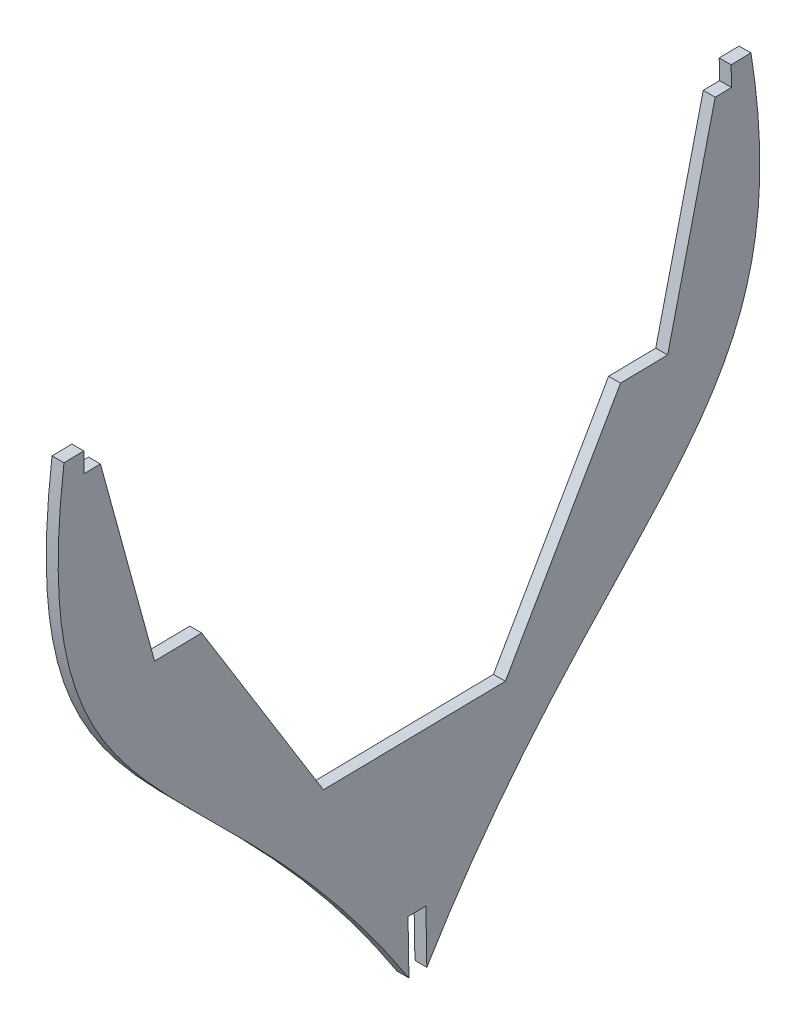
ISO-10303-21;
HEADER;
FILE_DESCRIPTION(('STEP AP214'),'2;1');
FILE_NAME('part.step','',(''),(''),'','','');
FILE_SCHEMA(('AUTOMOTIVE_DESIGN { 1 0 10303 214 1 1 1 1 }'));
ENDSEC;
DATA;
#1=APPLICATION_CONTEXT('core data for automotive mechanical design processes');
#2=APPLICATION_PROTOCOL_DEFINITION('international standard','automotive_design',2000,#1);
#3=PRODUCT_CONTEXT('',#1,'mechanical');
#4=PRODUCT('Part','Part','',(#3));
#5=PRODUCT_RELATED_PRODUCT_CATEGORY('part','',(#4));
#6=PRODUCT_DEFINITION_FORMATION('','',#4);
#7=PRODUCT_DEFINITION_CONTEXT('part definition',#1,'design');
#8=PRODUCT_DEFINITION('design','',#6,#7);
#9=PRODUCT_DEFINITION_SHAPE('','',#8);
#10=(LENGTH_UNIT() NAMED_UNIT(*) SI_UNIT(.MILLI.,.METRE.));
#11=(NAMED_UNIT(*) PLANE_ANGLE_UNIT() SI_UNIT($,.RADIAN.));
#12=(NAMED_UNIT(*) SI_UNIT($,.STERADIAN.) SOLID_ANGLE_UNIT());
#13=UNCERTAINTY_MEASURE_WITH_UNIT(LENGTH_MEASURE(1.E-05),#10,'distance_accuracy_value','');
#14=(GEOMETRIC_REPRESENTATION_CONTEXT(3) GLOBAL_UNCERTAINTY_ASSIGNED_CONTEXT((#13)) GLOBAL_UNIT_ASSIGNED_CONTEXT((#10,
#11,#12)) REPRESENTATION_CONTEXT('',''));
#15=CARTESIAN_POINT('',(0.,0.,0.));
#16=DIRECTION('',(0.,0.,1.));
#17=DIRECTION('',(1.,0.,0.));
#18=AXIS2_PLACEMENT_3D('',#15,#16,#17);
#19=CARTESIAN_POINT('',(6.,346.361590686847,178.714049927488));
#20=CARTESIAN_POINT('',(6.,179.047242687495,199.696494667992));
#21=CARTESIAN_POINT('',(6.,191.032704418316,103.545692170089));
#22=CARTESIAN_POINT('',(6.,27.7480189727311,0.461809733904394));
#23=B_SPLINE_CURVE_WITH_KNOTS('',3,(#19,#20,#21,#22),.UNSPECIFIED.,.F.,.F.,(4,4),(0.,1.),.UNSPECIFIED.);
#24=DIRECTION('',(-1.,0.,0.));
#25=VECTOR('',#24,1.);
#26=SURFACE_OF_LINEAR_EXTRUSION('',#23,#25);
#27=CARTESIAN_POINT('',(0.,346.361590686847,178.714049927488));
#28=CARTESIAN_POINT('',(0.,179.047242687495,199.696494667992));
#29=CARTESIAN_POINT('',(0.,191.032704418316,103.545692170089));
#30=CARTESIAN_POINT('',(0.,27.7480189727311,0.461809733904394));
#31=B_SPLINE_CURVE_WITH_KNOTS('',3,(#27,#28,#29,#30),.UNSPECIFIED.,.F.,.F.,(4,4),(0.,1.),.UNSPECIFIED.);
#32=CARTESIAN_POINT('',(0.,346.361590686847,178.714049927488));
#33=VERTEX_POINT('',#32);
#34=CARTESIAN_POINT('',(0.,34.9595724721525,5.08307792650354));
#35=VERTEX_POINT('',#34);
#36=EDGE_CURVE('E179',#33,#35,#31,.T.);
#37=ORIENTED_EDGE('',*,*,#36,.T.);
#38=DIRECTION('',(1.,0.,0.));
#39=VECTOR('',#38,1.);
#40=CARTESIAN_POINT('',(0.,34.9595724721525,5.08307792650354));
#41=LINE('',#40,#39);
#42=CARTESIAN_POINT('',(6.,34.9595724721525,5.08307792650354));
#43=VERTEX_POINT('',#42);
#44=EDGE_CURVE('E185',#35,#43,#41,.T.);
#45=ORIENTED_EDGE('',*,*,#44,.T.);
#46=CARTESIAN_POINT('',(6.,346.361590686847,178.714049927488));
#47=VERTEX_POINT('',#46);
#48=EDGE_CURVE('E219',#47,#43,#23,.T.);
#49=ORIENTED_EDGE('',*,*,#48,.F.);
#50=DIRECTION('',(-1.,0.,0.));
#51=VECTOR('',#50,1.);
#52=CARTESIAN_POINT('',(6.,346.361590686847,178.714049927488));
#53=LINE('',#52,#51);
#54=EDGE_CURVE('E175',#47,#33,#53,.T.);
#55=ORIENTED_EDGE('',*,*,#54,.T.);
#56=EDGE_LOOP('',(#37,#45,#49,#55));
#57=FACE_BOUND('',#56,.T.);
#58=ADVANCED_FACE('F33',(#57),#26,.F.);
#59=CARTESIAN_POINT('',(6.,27.7480189727311,0.461809733904394));
#60=CARTESIAN_POINT('',(6.,194.372569311942,-97.1313997810856));
#61=CARTESIAN_POINT('',(6.,185.593330999337,-193.627788773328));
#62=CARTESIAN_POINT('',(6.,352.116788837293,-167.089287997528));
#63=B_SPLINE_CURVE_WITH_KNOTS('',3,(#59,#60,#61,#62),.UNSPECIFIED.,.F.,.F.,(4,4),(0.,1.),.UNSPECIFIED.);
#64=DIRECTION('',(-1.,0.,0.));
#65=VECTOR('',#64,1.);
#66=SURFACE_OF_LINEAR_EXTRUSION('',#63,#65);
#67=CARTESIAN_POINT('',(6.,35.1093592951045,-3.91692207349647));
#68=VERTEX_POINT('',#67);
#69=CARTESIAN_POINT('',(6.,352.116788837293,-167.089287997528));
#70=VERTEX_POINT('',#69);
#71=EDGE_CURVE('E116',#68,#70,#63,.T.);
#72=ORIENTED_EDGE('',*,*,#71,.F.);
#73=DIRECTION('',(1.,0.,0.));
#74=VECTOR('',#73,1.);
#75=CARTESIAN_POINT('',(0.,35.1093592951045,-3.91692207349647));
#76=LINE('',#75,#74);
#77=CARTESIAN_POINT('',(0.,35.1093592951045,-3.91692207349647));
#78=VERTEX_POINT('',#77);
#79=EDGE_CURVE('E311',#78,#68,#76,.T.);
#80=ORIENTED_EDGE('',*,*,#79,.F.);
#81=CARTESIAN_POINT('',(0.,27.7480189727311,0.461809733904394));
#82=CARTESIAN_POINT('',(0.,194.372569311942,-97.1313997810856));
#83=CARTESIAN_POINT('',(0.,185.593330999337,-193.627788773328));
#84=CARTESIAN_POINT('',(0.,352.116788837293,-167.089287997528));
#85=B_SPLINE_CURVE_WITH_KNOTS('',3,(#81,#82,#83,#84),.UNSPECIFIED.,.F.,.F.,(4,4),(0.,1.),.UNSPECIFIED.);
#86=CARTESIAN_POINT('',(0.,352.116788837293,-167.089287997528));
#87=VERTEX_POINT('',#86);
#88=EDGE_CURVE('E184',#78,#87,#85,.T.);
#89=ORIENTED_EDGE('',*,*,#88,.T.);
#90=DIRECTION('',(-1.,0.,0.));
#91=VECTOR('',#90,1.);
#92=CARTESIAN_POINT('',(6.,352.116788837293,-167.089287997528));
#93=LINE('',#92,#91);
#94=EDGE_CURVE('E11',#70,#87,#93,.T.);
#95=ORIENTED_EDGE('',*,*,#94,.F.);
#96=EDGE_LOOP('',(#72,#80,#89,#95));
#97=FACE_BOUND('',#96,.T.);
#98=ADVANCED_FACE('F323',(#97),#66,.F.);
#99=CARTESIAN_POINT('',(6.,352.116788837293,-167.089287997528));
#100=DIRECTION('',(0.,-0.999861534367308,-0.0166406758472178));
#101=DIRECTION('',(0.,0.0166406758472178,-0.999861534367308));
#102=AXIS2_PLACEMENT_3D('',#99,#100,#101);
#103=PLANE('',#102);
#104=DIRECTION('',(0.,-0.0166406758472178,0.999861534367308));
#105=VECTOR('',#104,1.);
#106=CARTESIAN_POINT('',(0.,352.116788837293,-167.089287997528));
#107=LINE('',#106,#105);
#108=CARTESIAN_POINT('',(0.,351.950359034013,-157.089287997528));
#109=VERTEX_POINT('',#108);
#110=EDGE_CURVE('E192',#87,#109,#107,.T.);
#111=ORIENTED_EDGE('',*,*,#110,.T.);
#112=DIRECTION('',(-1.,0.,0.));
#113=VECTOR('',#112,1.);
#114=CARTESIAN_POINT('',(6.,351.950359034013,-157.089287997528));
#115=LINE('',#114,#113);
#116=CARTESIAN_POINT('',(6.,351.950359034013,-157.089287997528));
#117=VERTEX_POINT('',#116);
#118=EDGE_CURVE('E41',#117,#109,#115,.T.);
#119=ORIENTED_EDGE('',*,*,#118,.F.);
#120=DIRECTION('',(0.,-0.0166406758472178,0.999861534367308));
#121=VECTOR('',#120,1.);
#122=CARTESIAN_POINT('',(6.,352.116788837293,-167.089287997528));
#123=LINE('',#122,#121);
#124=EDGE_CURVE('E305',#70,#117,#123,.T.);
#125=ORIENTED_EDGE('',*,*,#124,.F.);
#126=ORIENTED_EDGE('',*,*,#94,.T.);
#127=EDGE_LOOP('',(#111,#119,#125,#126));
#128=FACE_BOUND('',#127,.T.);
#129=ADVANCED_FACE('F326',(#128),#103,.F.);
#130=CARTESIAN_POINT('',(6.,351.950359034013,-157.089287997528));
#131=DIRECTION('',(0.,0.0166406758472068,-0.999861534367308));
#132=DIRECTION('',(0.,0.999861534367308,0.0166406758472068));
#133=AXIS2_PLACEMENT_3D('',#130,#131,#132);
#134=PLANE('',#133);
#135=DIRECTION('',(0.,-0.999861534367308,-0.0166406758472068));
#136=VECTOR('',#135,1.);
#137=CARTESIAN_POINT('',(0.,351.950359034013,-157.089287997528));
#138=LINE('',#137,#136);
#139=CARTESIAN_POINT('',(0.,341.950359034013,-157.255717800808));
#140=VERTEX_POINT('',#139);
#141=EDGE_CURVE('E197',#109,#140,#138,.T.);
#142=ORIENTED_EDGE('',*,*,#141,.T.);
#143=DIRECTION('',(-1.,0.,0.));
#144=VECTOR('',#143,1.);
#145=CARTESIAN_POINT('',(6.,341.950359034013,-157.255717800808));
#146=LINE('',#145,#144);
#147=CARTESIAN_POINT('',(6.,341.950359034013,-157.255717800808));
#148=VERTEX_POINT('',#147);
#149=EDGE_CURVE('E244',#148,#140,#146,.T.);
#150=ORIENTED_EDGE('',*,*,#149,.F.);
#151=DIRECTION('',(0.,-0.999861534367308,-0.0166406758472068));
#152=VECTOR('',#151,1.);
#153=CARTESIAN_POINT('',(6.,351.950359034013,-157.089287997528));
#154=LINE('',#153,#152);
#155=EDGE_CURVE('E253',#117,#148,#154,.T.);
#156=ORIENTED_EDGE('',*,*,#155,.F.);
#157=ORIENTED_EDGE('',*,*,#118,.T.);
#158=EDGE_LOOP('',(#142,#150,#156,#157));
#159=FACE_BOUND('',#158,.T.);
#160=ADVANCED_FACE('F251',(#159),#134,.F.);
#161=CARTESIAN_POINT('',(6.,341.950359034013,-157.255717800808));
#162=DIRECTION('',(0.,-0.999861534367309,-0.0166406758471954));
#163=DIRECTION('',(0.,0.0166406758471954,-0.999861534367309));
#164=AXIS2_PLACEMENT_3D('',#161,#162,#163);
#165=PLANE('',#164);
#166=DIRECTION('',(0.,-0.0166406758471954,0.999861534367308));
#167=VECTOR('',#166,1.);
#168=CARTESIAN_POINT('',(0.,341.950359034013,-157.255717800808));
#169=LINE('',#168,#167);
#170=CARTESIAN_POINT('',(0.,341.813982846783,-149.061501107484));
#171=VERTEX_POINT('',#170);
#172=EDGE_CURVE('E199',#140,#171,#169,.T.);
#173=ORIENTED_EDGE('',*,*,#172,.T.);
#174=DIRECTION('',(-1.,0.,0.));
#175=VECTOR('',#174,1.);
#176=CARTESIAN_POINT('',(6.,341.813982846783,-149.061501107484));
#177=LINE('',#176,#175);
#178=CARTESIAN_POINT('',(6.,341.813982846783,-149.061501107484));
#179=VERTEX_POINT('',#178);
#180=EDGE_CURVE('E241',#179,#171,#177,.T.);
#181=ORIENTED_EDGE('',*,*,#180,.F.);
#182=DIRECTION('',(0.,-0.0166406758471954,0.999861534367308));
#183=VECTOR('',#182,1.);
#184=CARTESIAN_POINT('',(6.,341.950359034013,-157.255717800808));
#185=LINE('',#184,#183);
#186=EDGE_CURVE('E275',#148,#179,#185,.T.);
#187=ORIENTED_EDGE('',*,*,#186,.F.);
#188=ORIENTED_EDGE('',*,*,#149,.T.);
#189=EDGE_LOOP('',(#173,#181,#187,#188));
#190=FACE_BOUND('',#189,.T.);
#191=ADVANCED_FACE('F266',(#190),#165,.F.);
#192=CARTESIAN_POINT('',(6.,341.813982846783,-149.061501107484));
#193=DIRECTION('',(0.,-0.231720829517087,-0.972782327742395));
#194=DIRECTION('',(0.,0.972782327742396,-0.231720829517087));
#195=AXIS2_PLACEMENT_3D('',#192,#193,#194);
#196=PLANE('',#195);
#197=DIRECTION('',(0.,-0.972782327742396,0.231720829517087));
#198=VECTOR('',#197,1.);
#199=CARTESIAN_POINT('',(0.,341.813982846783,-149.061501107484));
#200=LINE('',#199,#198);
#201=CARTESIAN_POINT('',(0.,241.402058551779,-125.142959695404));
#202=VERTEX_POINT('',#201);
#203=EDGE_CURVE('E201',#171,#202,#200,.T.);
#204=ORIENTED_EDGE('',*,*,#203,.T.);
#205=DIRECTION('',(-1.,0.,0.));
#206=VECTOR('',#205,1.);
#207=CARTESIAN_POINT('',(6.,241.402058551779,-125.142959695404));
#208=LINE('',#207,#206);
#209=CARTESIAN_POINT('',(6.,241.402058551779,-125.142959695404));
#210=VERTEX_POINT('',#209);
#211=EDGE_CURVE('E238',#210,#202,#208,.T.);
#212=ORIENTED_EDGE('',*,*,#211,.F.);
#213=DIRECTION('',(0.,-0.972782327742396,0.231720829517087));
#214=VECTOR('',#213,1.);
#215=CARTESIAN_POINT('',(6.,341.813982846783,-149.061501107484));
#216=LINE('',#215,#214);
#217=EDGE_CURVE('E272',#179,#210,#216,.T.);
#218=ORIENTED_EDGE('',*,*,#217,.F.);
#219=ORIENTED_EDGE('',*,*,#180,.T.);
#220=EDGE_LOOP('',(#204,#212,#218,#219));
#221=FACE_BOUND('',#220,.T.);
#222=ADVANCED_FACE('F270',(#221),#196,.F.);
#223=CARTESIAN_POINT('',(6.,241.402058551779,-125.142959695404));
#224=DIRECTION('',(0.,-0.999861534367308,-0.0166406758472104));
#225=DIRECTION('',(0.,0.0166406758472104,-0.999861534367308));
#226=AXIS2_PLACEMENT_3D('',#223,#224,#225);
#227=PLANE('',#226);
#228=DIRECTION('',(0.,-0.0166406758472104,0.999861534367308));
#229=VECTOR('',#228,1.);
#230=CARTESIAN_POINT('',(0.,241.402058551779,-125.142959695404));
#231=LINE('',#230,#229);
#232=CARTESIAN_POINT('',(0.,241.007192196553,-101.417259884217));
#233=VERTEX_POINT('',#232);
#234=EDGE_CURVE('E203',#202,#233,#231,.T.);
#235=ORIENTED_EDGE('',*,*,#234,.T.);
#236=DIRECTION('',(-1.,0.,0.));
#237=VECTOR('',#236,1.);
#238=CARTESIAN_POINT('',(6.,241.007192196553,-101.417259884217));
#239=LINE('',#238,#237);
#240=CARTESIAN_POINT('',(6.,241.007192196553,-101.417259884217));
#241=VERTEX_POINT('',#240);
#242=EDGE_CURVE('E235',#241,#233,#239,.T.);
#243=ORIENTED_EDGE('',*,*,#242,.F.);
#244=DIRECTION('',(0.,-0.0166406758472104,0.999861534367308));
#245=VECTOR('',#244,1.);
#246=CARTESIAN_POINT('',(6.,241.402058551779,-125.142959695404));
#247=LINE('',#246,#245);
#248=EDGE_CURVE('E274',#210,#241,#247,.T.);
#249=ORIENTED_EDGE('',*,*,#248,.F.);
#250=ORIENTED_EDGE('',*,*,#211,.T.);
#251=EDGE_LOOP('',(#235,#243,#249,#250));
#252=FACE_BOUND('',#251,.T.);
#253=ADVANCED_FACE('F336',(#252),#227,.F.);
#254=CARTESIAN_POINT('',(6.,241.007192196553,-101.417259884217));
#255=DIRECTION('',(0.,-0.497713186186089,-0.867341676789771));
#256=DIRECTION('',(0.,0.867341676789771,-0.497713186186089));
#257=AXIS2_PLACEMENT_3D('',#254,#255,#256);
#258=PLANE('',#257);
#259=DIRECTION('',(0.,-0.867341676789771,0.497713186186089));
#260=VECTOR('',#259,1.);
#261=CARTESIAN_POINT('',(0.,241.007192196553,-101.417259884217));
#262=LINE('',#261,#260);
#263=CARTESIAN_POINT('',(0.,140.028964648975,-43.472165450215));
#264=VERTEX_POINT('',#263);
#265=EDGE_CURVE('E205',#233,#264,#262,.T.);
#266=ORIENTED_EDGE('',*,*,#265,.T.);
#267=DIRECTION('',(-1.,0.,0.));
#268=VECTOR('',#267,1.);
#269=CARTESIAN_POINT('',(6.,140.028964648975,-43.472165450215));
#270=LINE('',#269,#268);
#271=CARTESIAN_POINT('',(6.,140.028964648975,-43.472165450215));
#272=VERTEX_POINT('',#271);
#273=EDGE_CURVE('E232',#272,#264,#270,.T.);
#274=ORIENTED_EDGE('',*,*,#273,.F.);
#275=DIRECTION('',(0.,-0.867341676789771,0.497713186186089));
#276=VECTOR('',#275,1.);
#277=CARTESIAN_POINT('',(6.,241.007192196553,-101.417259884217));
#278=LINE('',#277,#276);
#279=EDGE_CURVE('E277',#241,#272,#278,.T.);
#280=ORIENTED_EDGE('',*,*,#279,.F.);
#281=ORIENTED_EDGE('',*,*,#242,.T.);
#282=EDGE_LOOP('',(#266,#274,#280,#281));
#283=FACE_BOUND('',#282,.T.);
#284=ADVANCED_FACE('F339',(#283),#258,.F.);
#285=CARTESIAN_POINT('',(6.,138.504801128242,48.1077974347316));
#286=DIRECTION('',(0.,-0.999861534367308,-0.0166406758472082));
#287=DIRECTION('',(0.,0.0166406758472082,-0.999861534367308));
#288=AXIS2_PLACEMENT_3D('',#285,#286,#287);
#289=PLANE('',#288);
#290=DIRECTION('',(0.,-0.0166406758472082,0.999861534367308));
#291=VECTOR('',#290,1.);
#292=CARTESIAN_POINT('',(0.,138.504801128242,48.1077974347316));
#293=LINE('',#292,#291);
#294=CARTESIAN_POINT('',(0.,138.504801128242,48.1077974347316));
#295=VERTEX_POINT('',#294);
#296=EDGE_CURVE('E207',#264,#295,#293,.T.);
#297=ORIENTED_EDGE('',*,*,#296,.T.);
#298=DIRECTION('',(-1.,0.,0.));
#299=VECTOR('',#298,1.);
#300=CARTESIAN_POINT('',(6.,138.504801128242,48.1077974347316));
#301=LINE('',#300,#299);
#302=CARTESIAN_POINT('',(6.,138.504801128242,48.1077974347316));
#303=VERTEX_POINT('',#302);
#304=EDGE_CURVE('E229',#303,#295,#301,.T.);
#305=ORIENTED_EDGE('',*,*,#304,.F.);
#306=DIRECTION('',(0.,-0.0166406758472082,0.999861534367308));
#307=VECTOR('',#306,1.);
#308=CARTESIAN_POINT('',(6.,138.504801128242,48.1077974347316));
#309=LINE('',#308,#307);
#310=EDGE_CURVE('E283',#272,#303,#309,.T.);
#311=ORIENTED_EDGE('',*,*,#310,.F.);
#312=ORIENTED_EDGE('',*,*,#273,.T.);
#313=EDGE_LOOP('',(#297,#305,#311,#312));
#314=FACE_BOUND('',#313,.T.);
#315=ADVANCED_FACE('F343',(#314),#289,.F.);
#316=CARTESIAN_POINT('',(6.,237.498880454126,109.381027038175));
#317=DIRECTION('',(0.,-0.526299846979739,0.850299048023167));
#318=DIRECTION('',(0.,-0.850299048023167,-0.526299846979739));
#319=AXIS2_PLACEMENT_3D('',#316,#317,#318);
#320=PLANE('',#319);
#321=DIRECTION('',(0.,0.850299048023167,0.526299846979739));
#322=VECTOR('',#321,1.);
#323=CARTESIAN_POINT('',(0.,237.498880454126,109.381027038175));
#324=LINE('',#323,#322);
#325=CARTESIAN_POINT('',(0.,237.498880454126,109.381027038175));
#326=VERTEX_POINT('',#325);
#327=EDGE_CURVE('E209',#295,#326,#324,.T.);
#328=ORIENTED_EDGE('',*,*,#327,.T.);
#329=DIRECTION('',(-1.,0.,0.));
#330=VECTOR('',#329,1.);
#331=CARTESIAN_POINT('',(6.,237.498880454126,109.381027038175));
#332=LINE('',#331,#330);
#333=CARTESIAN_POINT('',(6.,237.498880454126,109.381027038175));
#334=VERTEX_POINT('',#333);
#335=EDGE_CURVE('E226',#334,#326,#332,.T.);
#336=ORIENTED_EDGE('',*,*,#335,.F.);
#337=DIRECTION('',(0.,0.850299048023167,0.526299846979739));
#338=VECTOR('',#337,1.);
#339=CARTESIAN_POINT('',(6.,237.498880454126,109.381027038175));
#340=LINE('',#339,#338);
#341=EDGE_CURVE('E285',#303,#334,#340,.T.);
#342=ORIENTED_EDGE('',*,*,#341,.F.);
#343=ORIENTED_EDGE('',*,*,#304,.T.);
#344=EDGE_LOOP('',(#328,#336,#342,#343));
#345=FACE_BOUND('',#344,.T.);
#346=ADVANCED_FACE('F347',(#345),#320,.F.);
#347=CARTESIAN_POINT('',(6.,237.1040140989,133.106726849363));
#348=DIRECTION('',(0.,-0.999861534367308,-0.016640675847208));
#349=DIRECTION('',(0.,0.016640675847208,-0.999861534367308));
#350=AXIS2_PLACEMENT_3D('',#347,#348,#349);
#351=PLANE('',#350);
#352=DIRECTION('',(0.,-0.016640675847208,0.999861534367308));
#353=VECTOR('',#352,1.);
#354=CARTESIAN_POINT('',(0.,237.1040140989,133.106726849363));
#355=LINE('',#354,#353);
#356=CARTESIAN_POINT('',(0.,237.1040140989,133.106726849363));
#357=VERTEX_POINT('',#356);
#358=EDGE_CURVE('E211',#326,#357,#355,.T.);
#359=ORIENTED_EDGE('',*,*,#358,.T.);
#360=DIRECTION('',(-1.,0.,0.));
#361=VECTOR('',#360,1.);
#362=CARTESIAN_POINT('',(6.,237.1040140989,133.106726849363));
#363=LINE('',#362,#361);
#364=CARTESIAN_POINT('',(6.,237.1040140989,133.106726849363));
#365=VERTEX_POINT('',#364);
#366=EDGE_CURVE('E223',#365,#357,#363,.T.);
#367=ORIENTED_EDGE('',*,*,#366,.F.);
#368=DIRECTION('',(0.,-0.016640675847208,0.999861534367308));
#369=VECTOR('',#368,1.);
#370=CARTESIAN_POINT('',(6.,237.1040140989,133.106726849363));
#371=LINE('',#370,#369);
#372=EDGE_CURVE('E287',#334,#365,#371,.T.);
#373=ORIENTED_EDGE('',*,*,#372,.F.);
#374=ORIENTED_EDGE('',*,*,#335,.T.);
#375=EDGE_LOOP('',(#359,#367,#373,#374));
#376=FACE_BOUND('',#375,.T.);
#377=ADVANCED_FACE('F293',(#376),#351,.F.);
#378=CARTESIAN_POINT('',(6.,336.664396677358,160.353403430883));
#379=DIRECTION('',(0.,-0.263963524793587,0.964532662784701));
#380=DIRECTION('',(0.,-0.964532662784701,-0.263963524793587));
#381=AXIS2_PLACEMENT_3D('',#378,#379,#380);
#382=PLANE('',#381);
#383=DIRECTION('',(0.,0.964532662784701,0.263963524793587));
#384=VECTOR('',#383,1.);
#385=CARTESIAN_POINT('',(0.,336.664396677358,160.353403430883));
#386=LINE('',#385,#384);
#387=CARTESIAN_POINT('',(0.,336.664396677358,160.353403430883));
#388=VERTEX_POINT('',#387);
#389=EDGE_CURVE('E213',#357,#388,#386,.T.);
#390=ORIENTED_EDGE('',*,*,#389,.T.);
#391=DIRECTION('',(-1.,0.,0.));
#392=VECTOR('',#391,1.);
#393=CARTESIAN_POINT('',(6.,336.664396677358,160.353403430883));
#394=LINE('',#393,#392);
#395=CARTESIAN_POINT('',(6.,336.664396677358,160.353403430883));
#396=VERTEX_POINT('',#395);
#397=EDGE_CURVE('E170',#396,#388,#394,.T.);
#398=ORIENTED_EDGE('',*,*,#397,.F.);
#399=DIRECTION('',(0.,0.964532662784701,0.263963524793587));
#400=VECTOR('',#399,1.);
#401=CARTESIAN_POINT('',(6.,336.664396677358,160.353403430883));
#402=LINE('',#401,#400);
#403=EDGE_CURVE('E158',#365,#396,#402,.T.);
#404=ORIENTED_EDGE('',*,*,#403,.F.);
#405=ORIENTED_EDGE('',*,*,#366,.T.);
#406=EDGE_LOOP('',(#390,#398,#404,#405));
#407=FACE_BOUND('',#406,.T.);
#408=ADVANCED_FACE('F297',(#407),#382,.F.);
#409=CARTESIAN_POINT('',(6.,336.528020490127,168.547620124208));
#410=DIRECTION('',(0.,-0.999861534367308,-0.016640675847209));
#411=DIRECTION('',(0.,0.016640675847209,-0.999861534367308));
#412=AXIS2_PLACEMENT_3D('',#409,#410,#411);
#413=PLANE('',#412);
#414=DIRECTION('',(0.,-0.016640675847209,0.999861534367308));
#415=VECTOR('',#414,1.);
#416=CARTESIAN_POINT('',(0.,336.528020490127,168.547620124208));
#417=LINE('',#416,#415);
#418=CARTESIAN_POINT('',(0.,336.528020490127,168.547620124208));
#419=VERTEX_POINT('',#418);
#420=EDGE_CURVE('E167',#388,#419,#417,.T.);
#421=ORIENTED_EDGE('',*,*,#420,.T.);
#422=DIRECTION('',(-1.,0.,0.));
#423=VECTOR('',#422,1.);
#424=CARTESIAN_POINT('',(6.,336.528020490127,168.547620124208));
#425=LINE('',#424,#423);
#426=CARTESIAN_POINT('',(6.,336.528020490127,168.547620124208));
#427=VERTEX_POINT('',#426);
#428=EDGE_CURVE('E164',#427,#419,#425,.T.);
#429=ORIENTED_EDGE('',*,*,#428,.F.);
#430=DIRECTION('',(0.,-0.016640675847209,0.999861534367308));
#431=VECTOR('',#430,1.);
#432=CARTESIAN_POINT('',(6.,336.528020490127,168.547620124208));
#433=LINE('',#432,#431);
#434=EDGE_CURVE('E151',#396,#427,#433,.T.);
#435=ORIENTED_EDGE('',*,*,#434,.F.);
#436=ORIENTED_EDGE('',*,*,#397,.T.);
#437=EDGE_LOOP('',(#421,#429,#435,#436));
#438=FACE_BOUND('',#437,.T.);
#439=ADVANCED_FACE('F165',(#438),#413,.F.);
#440=CARTESIAN_POINT('',(6.,346.528020490127,168.714049927488));
#441=DIRECTION('',(0.,-0.0166406758472068,0.999861534367308));
#442=DIRECTION('',(0.,-0.999861534367308,-0.0166406758472068));
#443=AXIS2_PLACEMENT_3D('',#440,#441,#442);
#444=PLANE('',#443);
#445=DIRECTION('',(0.,0.999861534367308,0.0166406758472068));
#446=VECTOR('',#445,1.);
#447=CARTESIAN_POINT('',(0.,346.528020490127,168.714049927488));
#448=LINE('',#447,#446);
#449=CARTESIAN_POINT('',(0.,346.528020490127,168.714049927488));
#450=VERTEX_POINT('',#449);
#451=EDGE_CURVE('E216',#419,#450,#448,.T.);
#452=ORIENTED_EDGE('',*,*,#451,.T.);
#453=DIRECTION('',(-1.,0.,0.));
#454=VECTOR('',#453,1.);
#455=CARTESIAN_POINT('',(6.,346.528020490127,168.714049927488));
#456=LINE('',#455,#454);
#457=CARTESIAN_POINT('',(6.,346.528020490127,168.714049927488));
#458=VERTEX_POINT('',#457);
#459=EDGE_CURVE('E171',#458,#450,#456,.T.);
#460=ORIENTED_EDGE('',*,*,#459,.F.);
#461=DIRECTION('',(0.,0.999861534367308,0.0166406758472068));
#462=VECTOR('',#461,1.);
#463=CARTESIAN_POINT('',(6.,346.528020490127,168.714049927488));
#464=LINE('',#463,#462);
#465=EDGE_CURVE('E155',#427,#458,#464,.T.);
#466=ORIENTED_EDGE('',*,*,#465,.F.);
#467=ORIENTED_EDGE('',*,*,#428,.T.);
#468=EDGE_LOOP('',(#452,#460,#466,#467));
#469=FACE_BOUND('',#468,.T.);
#470=ADVANCED_FACE('F173',(#469),#444,.F.);
#471=CARTESIAN_POINT('',(6.,346.361590686847,178.714049927488));
#472=DIRECTION('',(0.,-0.999861534367308,-0.0166406758472067));
#473=DIRECTION('',(0.,0.0166406758472067,-0.999861534367308));
#474=AXIS2_PLACEMENT_3D('',#471,#472,#473);
#475=PLANE('',#474);
#476=DIRECTION('',(0.,-0.0166406758472067,0.999861534367308));
#477=VECTOR('',#476,1.);
#478=CARTESIAN_POINT('',(0.,346.361590686847,178.714049927488));
#479=LINE('',#478,#477);
#480=EDGE_CURVE('E108',#450,#33,#479,.T.);
#481=ORIENTED_EDGE('',*,*,#480,.T.);
#482=ORIENTED_EDGE('',*,*,#54,.F.);
#483=DIRECTION('',(0.,-0.0166406758472067,0.999861534367308));
#484=VECTOR('',#483,1.);
#485=CARTESIAN_POINT('',(6.,346.361590686847,178.714049927488));
#486=LINE('',#485,#484);
#487=EDGE_CURVE('E57',#458,#47,#486,.T.);
#488=ORIENTED_EDGE('',*,*,#487,.F.);
#489=ORIENTED_EDGE('',*,*,#459,.T.);
#490=EDGE_LOOP('',(#481,#482,#488,#489));
#491=FACE_BOUND('',#490,.T.);
#492=ADVANCED_FACE('F299',(#491),#475,.F.);
#493=CARTESIAN_POINT('',(6.,185.543681372127,136.112802521954));
#494=DIRECTION('',(-1.,0.,0.));
#495=DIRECTION('',(0.,0.,1.));
#496=AXIS2_PLACEMENT_3D('',#493,#494,#495);
#497=PLANE('',#496);
#498=ORIENTED_EDGE('',*,*,#48,.T.);
#499=DIRECTION('',(0.,-0.999861534367308,-0.0166406758472082));
#500=VECTOR('',#499,1.);
#501=CARTESIAN_POINT('',(6.,34.9595724721525,5.08307792650354));
#502=LINE('',#501,#500);
#503=CARTESIAN_POINT('',(6.,61.9595724721525,5.53243839535979));
#504=VERTEX_POINT('',#503);
#505=EDGE_CURVE('E499',#504,#43,#502,.T.);
#506=ORIENTED_EDGE('',*,*,#505,.F.);
#507=DIRECTION('',(0.,-0.0166406758472079,0.999861534367309));
#508=VECTOR('',#507,1.);
#509=CARTESIAN_POINT('',(6.,61.9595724721525,5.53243839535979));
#510=LINE('',#509,#508);
#511=CARTESIAN_POINT('',(6.,62.1093592951045,-3.46756160464021));
#512=VERTEX_POINT('',#511);
#513=EDGE_CURVE('E507',#512,#504,#510,.T.);
#514=ORIENTED_EDGE('',*,*,#513,.F.);
#515=DIRECTION('',(0.,0.999861534367308,0.0166406758472084));
#516=VECTOR('',#515,1.);
#517=CARTESIAN_POINT('',(6.,62.1093592951045,-3.46756160464021));
#518=LINE('',#517,#516);
#519=EDGE_CURVE('E511',#68,#512,#518,.T.);
#520=ORIENTED_EDGE('',*,*,#519,.F.);
#521=ORIENTED_EDGE('',*,*,#71,.T.);
#522=ORIENTED_EDGE('',*,*,#124,.T.);
#523=ORIENTED_EDGE('',*,*,#155,.T.);
#524=ORIENTED_EDGE('',*,*,#186,.T.);
#525=ORIENTED_EDGE('',*,*,#217,.T.);
#526=ORIENTED_EDGE('',*,*,#248,.T.);
#527=ORIENTED_EDGE('',*,*,#279,.T.);
#528=ORIENTED_EDGE('',*,*,#310,.T.);
#529=ORIENTED_EDGE('',*,*,#341,.T.);
#530=ORIENTED_EDGE('',*,*,#372,.T.);
#531=ORIENTED_EDGE('',*,*,#403,.T.);
#532=ORIENTED_EDGE('',*,*,#434,.T.);
#533=ORIENTED_EDGE('',*,*,#465,.T.);
#534=ORIENTED_EDGE('',*,*,#487,.T.);
#535=EDGE_LOOP('',(#498,#506,#514,#520,#521,#522,#523,#524,#525,#526,#527,#528,#529,#530,#531,
#532,#533,#534));
#536=FACE_BOUND('',#535,.T.);
#537=ADVANCED_FACE('F153',(#536),#497,.F.);
#538=CARTESIAN_POINT('',(0.,185.543681372127,136.112802521954));
#539=DIRECTION('',(-1.,0.,0.));
#540=DIRECTION('',(0.,0.,1.));
#541=AXIS2_PLACEMENT_3D('',#538,#539,#540);
#542=PLANE('',#541);
#543=DIRECTION('',(0.,-0.999861534367308,-0.0166406758472082));
#544=VECTOR('',#543,1.);
#545=CARTESIAN_POINT('',(0.,34.9595724721525,5.08307792650354));
#546=LINE('',#545,#544);
#547=CARTESIAN_POINT('',(0.,61.9595724721525,5.53243839535979));
#548=VERTEX_POINT('',#547);
#549=EDGE_CURVE('E520',#548,#35,#546,.T.);
#550=ORIENTED_EDGE('',*,*,#549,.T.);
#551=ORIENTED_EDGE('',*,*,#36,.F.);
#552=ORIENTED_EDGE('',*,*,#480,.F.);
#553=ORIENTED_EDGE('',*,*,#451,.F.);
#554=ORIENTED_EDGE('',*,*,#420,.F.);
#555=ORIENTED_EDGE('',*,*,#389,.F.);
#556=ORIENTED_EDGE('',*,*,#358,.F.);
#557=ORIENTED_EDGE('',*,*,#327,.F.);
#558=ORIENTED_EDGE('',*,*,#296,.F.);
#559=ORIENTED_EDGE('',*,*,#265,.F.);
#560=ORIENTED_EDGE('',*,*,#234,.F.);
#561=ORIENTED_EDGE('',*,*,#203,.F.);
#562=ORIENTED_EDGE('',*,*,#172,.F.);
#563=ORIENTED_EDGE('',*,*,#141,.F.);
#564=ORIENTED_EDGE('',*,*,#110,.F.);
#565=ORIENTED_EDGE('',*,*,#88,.F.);
#566=DIRECTION('',(0.,0.999861534367308,0.0166406758472084));
#567=VECTOR('',#566,1.);
#568=CARTESIAN_POINT('',(0.,62.1093592951045,-3.46756160464021));
#569=LINE('',#568,#567);
#570=CARTESIAN_POINT('',(0.,62.1093592951046,-3.46756160464022));
#571=VERTEX_POINT('',#570);
#572=EDGE_CURVE('E506',#78,#571,#569,.T.);
#573=ORIENTED_EDGE('',*,*,#572,.T.);
#574=DIRECTION('',(0.,-0.0166406758472079,0.999861534367309));
#575=VECTOR('',#574,1.);
#576=CARTESIAN_POINT('',(0.,61.9595724721525,5.53243839535979));
#577=LINE('',#576,#575);
#578=EDGE_CURVE('E48',#571,#548,#577,.T.);
#579=ORIENTED_EDGE('',*,*,#578,.T.);
#580=EDGE_LOOP('',(#550,#551,#552,#553,#554,#555,#556,#557,#558,#559,#560,#561,#562,#563,#564,
#565,#573,#579));
#581=FACE_BOUND('',#580,.T.);
#582=ADVANCED_FACE('F260',(#581),#542,.T.);
#583=CARTESIAN_POINT('',(0.,34.9595724721525,5.08307792650354));
#584=DIRECTION('',(0.,-0.0166406758472082,0.999861534367308));
#585=DIRECTION('',(0.,-0.999861534367308,-0.0166406758472082));
#586=AXIS2_PLACEMENT_3D('',#583,#584,#585);
#587=PLANE('',#586);
#588=ORIENTED_EDGE('',*,*,#505,.T.);
#589=ORIENTED_EDGE('',*,*,#44,.F.);
#590=ORIENTED_EDGE('',*,*,#549,.F.);
#591=DIRECTION('',(1.,0.,0.));
#592=VECTOR('',#591,1.);
#593=CARTESIAN_POINT('',(0.,61.9595724721525,5.53243839535979));
#594=LINE('',#593,#592);
#595=EDGE_CURVE('E502',#548,#504,#594,.T.);
#596=ORIENTED_EDGE('',*,*,#595,.T.);
#597=EDGE_LOOP('',(#588,#589,#590,#596));
#598=FACE_BOUND('',#597,.T.);
#599=ADVANCED_FACE('F364',(#598),#587,.F.);
#600=CARTESIAN_POINT('',(0.,61.9595724721525,5.53243839535979));
#601=DIRECTION('',(0.,0.999861534367308,0.0166406758472079));
#602=DIRECTION('',(0.,-0.0166406758472079,0.999861534367309));
#603=AXIS2_PLACEMENT_3D('',#600,#601,#602);
#604=PLANE('',#603);
#605=ORIENTED_EDGE('',*,*,#513,.T.);
#606=ORIENTED_EDGE('',*,*,#595,.F.);
#607=ORIENTED_EDGE('',*,*,#578,.F.);
#608=DIRECTION('',(1.,0.,0.));
#609=VECTOR('',#608,1.);
#610=CARTESIAN_POINT('',(0.,62.1093592951045,-3.46756160464021));
#611=LINE('',#610,#609);
#612=EDGE_CURVE('E516',#571,#512,#611,.T.);
#613=ORIENTED_EDGE('',*,*,#612,.T.);
#614=EDGE_LOOP('',(#605,#606,#607,#613));
#615=FACE_BOUND('',#614,.T.);
#616=ADVANCED_FACE('F370',(#615),#604,.F.);
#617=CARTESIAN_POINT('',(0.,62.1093592951045,-3.46756160464021));
#618=DIRECTION('',(0.,0.0166406758472084,-0.999861534367308));
#619=DIRECTION('',(0.,0.999861534367308,0.0166406758472084));
#620=AXIS2_PLACEMENT_3D('',#617,#618,#619);
#621=PLANE('',#620);
#622=ORIENTED_EDGE('',*,*,#519,.T.);
#623=ORIENTED_EDGE('',*,*,#612,.F.);
#624=ORIENTED_EDGE('',*,*,#572,.F.);
#625=ORIENTED_EDGE('',*,*,#79,.T.);
#626=EDGE_LOOP('',(#622,#623,#624,#625));
#627=FACE_BOUND('',#626,.T.);
#628=ADVANCED_FACE('F367',(#627),#621,.F.);
#629=CLOSED_SHELL('',(#58,#98,#129,#160,#191,#222,#253,#284,#315,#346,#377,#408,#439,#470,#492,
#537,#582,#599,#616,#628));
#630=MANIFOLD_SOLID_BREP('B2',#629);
#631=ADVANCED_BREP_SHAPE_REPRESENTATION('',(#18,#630),#14);
#632=SHAPE_DEFINITION_REPRESENTATION(#9,#631);
ENDSEC;
END-ISO-10303-21;
